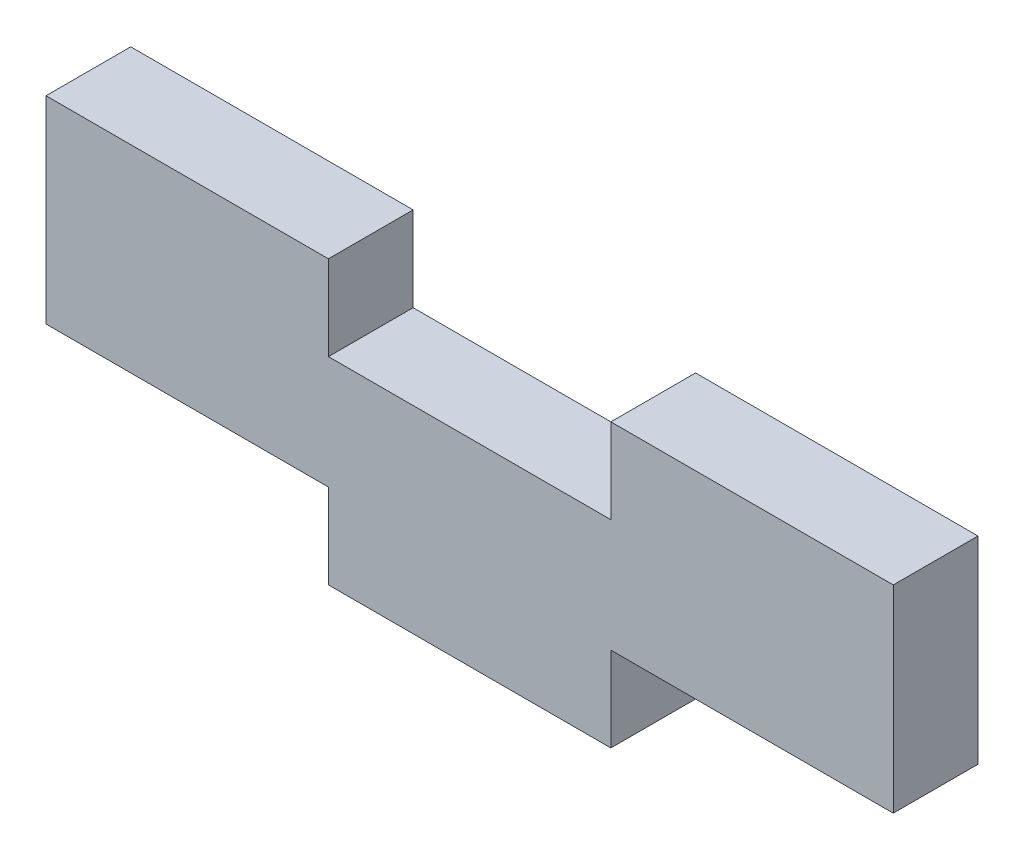
ISO-10303-21;
HEADER;
FILE_DESCRIPTION(('STEP AP214'),'2;1');
FILE_NAME('part.step','',(''),(''),'','','');
FILE_SCHEMA(('AUTOMOTIVE_DESIGN { 1 0 10303 214 1 1 1 1 }'));
ENDSEC;
DATA;
#1=APPLICATION_CONTEXT('core data for automotive mechanical design processes');
#2=APPLICATION_PROTOCOL_DEFINITION('international standard','automotive_design',2000,#1);
#3=PRODUCT_CONTEXT('',#1,'mechanical');
#4=PRODUCT('Part','Part','',(#3));
#5=PRODUCT_RELATED_PRODUCT_CATEGORY('part','',(#4));
#6=PRODUCT_DEFINITION_FORMATION('','',#4);
#7=PRODUCT_DEFINITION_CONTEXT('part definition',#1,'design');
#8=PRODUCT_DEFINITION('design','',#6,#7);
#9=PRODUCT_DEFINITION_SHAPE('','',#8);
#10=(LENGTH_UNIT() NAMED_UNIT(*) SI_UNIT(.MILLI.,.METRE.));
#11=(NAMED_UNIT(*) PLANE_ANGLE_UNIT() SI_UNIT($,.RADIAN.));
#12=(NAMED_UNIT(*) SI_UNIT($,.STERADIAN.) SOLID_ANGLE_UNIT());
#13=UNCERTAINTY_MEASURE_WITH_UNIT(LENGTH_MEASURE(1.E-05),#10,'distance_accuracy_value','');
#14=(GEOMETRIC_REPRESENTATION_CONTEXT(3) GLOBAL_UNCERTAINTY_ASSIGNED_CONTEXT((#13)) GLOBAL_UNIT_ASSIGNED_CONTEXT((#10,
#11,#12)) REPRESENTATION_CONTEXT('',''));
#15=CARTESIAN_POINT('',(0.,0.,0.));
#16=DIRECTION('',(0.,0.,1.));
#17=DIRECTION('',(1.,0.,0.));
#18=AXIS2_PLACEMENT_3D('',#15,#16,#17);
#19=CARTESIAN_POINT('',(0.,7.,3.));
#20=DIRECTION('',(-1.,0.,0.));
#21=DIRECTION('',(0.,-1.,0.));
#22=AXIS2_PLACEMENT_3D('',#19,#20,#21);
#23=PLANE('',#22);
#24=DIRECTION('',(0.,1.,0.));
#25=VECTOR('',#24,1.);
#26=CARTESIAN_POINT('',(0.,7.,0.));
#27=LINE('',#26,#25);
#28=CARTESIAN_POINT('',(0.,0.,0.));
#29=VERTEX_POINT('',#28);
#30=CARTESIAN_POINT('',(0.,7.,0.));
#31=VERTEX_POINT('',#30);
#32=EDGE_CURVE('E153',#29,#31,#27,.T.);
#33=ORIENTED_EDGE('',*,*,#32,.T.);
#34=DIRECTION('',(0.,0.,-1.));
#35=VECTOR('',#34,1.);
#36=CARTESIAN_POINT('',(0.,7.,3.));
#37=LINE('',#36,#35);
#38=CARTESIAN_POINT('',(0.,7.,3.));
#39=VERTEX_POINT('',#38);
#40=EDGE_CURVE('E11',#39,#31,#37,.T.);
#41=ORIENTED_EDGE('',*,*,#40,.F.);
#42=DIRECTION('',(0.,1.,0.));
#43=VECTOR('',#42,1.);
#44=CARTESIAN_POINT('',(0.,7.,3.));
#45=LINE('',#44,#43);
#46=CARTESIAN_POINT('',(0.,0.,3.));
#47=VERTEX_POINT('',#46);
#48=EDGE_CURVE('E175',#47,#39,#45,.T.);
#49=ORIENTED_EDGE('',*,*,#48,.F.);
#50=DIRECTION('',(0.,0.,-1.));
#51=VECTOR('',#50,1.);
#52=CARTESIAN_POINT('',(0.,0.,3.));
#53=LINE('',#52,#51);
#54=EDGE_CURVE('E149',#47,#29,#53,.T.);
#55=ORIENTED_EDGE('',*,*,#54,.T.);
#56=EDGE_LOOP('',(#33,#41,#49,#55));
#57=FACE_BOUND('',#56,.T.);
#58=ADVANCED_FACE('F33',(#57),#23,.F.);
#59=CARTESIAN_POINT('',(-10.,7.,3.));
#60=DIRECTION('',(0.,-1.,0.));
#61=DIRECTION('',(0.,0.,-1.));
#62=AXIS2_PLACEMENT_3D('',#59,#60,#61);
#63=PLANE('',#62);
#64=DIRECTION('',(-1.,0.,0.));
#65=VECTOR('',#64,1.);
#66=CARTESIAN_POINT('',(-10.,7.,0.));
#67=LINE('',#66,#65);
#68=CARTESIAN_POINT('',(-10.,7.,0.));
#69=VERTEX_POINT('',#68);
#70=EDGE_CURVE('E156',#31,#69,#67,.T.);
#71=ORIENTED_EDGE('',*,*,#70,.T.);
#72=DIRECTION('',(0.,0.,-1.));
#73=VECTOR('',#72,1.);
#74=CARTESIAN_POINT('',(-10.,7.,3.));
#75=LINE('',#74,#73);
#76=CARTESIAN_POINT('',(-10.,7.,3.));
#77=VERTEX_POINT('',#76);
#78=EDGE_CURVE('E41',#77,#69,#75,.T.);
#79=ORIENTED_EDGE('',*,*,#78,.F.);
#80=DIRECTION('',(-1.,0.,0.));
#81=VECTOR('',#80,1.);
#82=CARTESIAN_POINT('',(-10.,7.,3.));
#83=LINE('',#82,#81);
#84=EDGE_CURVE('E104',#39,#77,#83,.T.);
#85=ORIENTED_EDGE('',*,*,#84,.F.);
#86=ORIENTED_EDGE('',*,*,#40,.T.);
#87=EDGE_LOOP('',(#71,#79,#85,#86));
#88=FACE_BOUND('',#87,.T.);
#89=ADVANCED_FACE('F253',(#88),#63,.F.);
#90=CARTESIAN_POINT('',(-10.,4.,3.));
#91=DIRECTION('',(1.,0.,0.));
#92=DIRECTION('',(0.,0.,-1.));
#93=AXIS2_PLACEMENT_3D('',#90,#91,#92);
#94=PLANE('',#93);
#95=DIRECTION('',(0.,-1.,0.));
#96=VECTOR('',#95,1.);
#97=CARTESIAN_POINT('',(-10.,4.,0.));
#98=LINE('',#97,#96);
#99=CARTESIAN_POINT('',(-10.,4.,0.));
#100=VERTEX_POINT('',#99);
#101=EDGE_CURVE('E158',#69,#100,#98,.T.);
#102=ORIENTED_EDGE('',*,*,#101,.T.);
#103=DIRECTION('',(0.,0.,-1.));
#104=VECTOR('',#103,1.);
#105=CARTESIAN_POINT('',(-10.,4.,3.));
#106=LINE('',#105,#104);
#107=CARTESIAN_POINT('',(-10.,4.,3.));
#108=VERTEX_POINT('',#107);
#109=EDGE_CURVE('E194',#108,#100,#106,.T.);
#110=ORIENTED_EDGE('',*,*,#109,.F.);
#111=DIRECTION('',(0.,-1.,0.));
#112=VECTOR('',#111,1.);
#113=CARTESIAN_POINT('',(-10.,4.,3.));
#114=LINE('',#113,#112);
#115=EDGE_CURVE('E202',#77,#108,#114,.T.);
#116=ORIENTED_EDGE('',*,*,#115,.F.);
#117=ORIENTED_EDGE('',*,*,#78,.T.);
#118=EDGE_LOOP('',(#102,#110,#116,#117));
#119=FACE_BOUND('',#118,.T.);
#120=ADVANCED_FACE('F200',(#119),#94,.F.);
#121=CARTESIAN_POINT('',(-20.,4.,3.));
#122=DIRECTION('',(0.,-1.,0.));
#123=DIRECTION('',(0.,0.,-1.));
#124=AXIS2_PLACEMENT_3D('',#121,#122,#123);
#125=PLANE('',#124);
#126=DIRECTION('',(-1.,0.,0.));
#127=VECTOR('',#126,1.);
#128=CARTESIAN_POINT('',(-20.,4.,0.));
#129=LINE('',#128,#127);
#130=CARTESIAN_POINT('',(-20.,4.,0.));
#131=VERTEX_POINT('',#130);
#132=EDGE_CURVE('E160',#100,#131,#129,.T.);
#133=ORIENTED_EDGE('',*,*,#132,.T.);
#134=DIRECTION('',(0.,0.,-1.));
#135=VECTOR('',#134,1.);
#136=CARTESIAN_POINT('',(-20.,4.,3.));
#137=LINE('',#136,#135);
#138=CARTESIAN_POINT('',(-20.,4.,3.));
#139=VERTEX_POINT('',#138);
#140=EDGE_CURVE('E191',#139,#131,#137,.T.);
#141=ORIENTED_EDGE('',*,*,#140,.F.);
#142=DIRECTION('',(-1.,0.,0.));
#143=VECTOR('',#142,1.);
#144=CARTESIAN_POINT('',(-20.,4.,3.));
#145=LINE('',#144,#143);
#146=EDGE_CURVE('E220',#108,#139,#145,.T.);
#147=ORIENTED_EDGE('',*,*,#146,.F.);
#148=ORIENTED_EDGE('',*,*,#109,.T.);
#149=EDGE_LOOP('',(#133,#141,#147,#148));
#150=FACE_BOUND('',#149,.T.);
#151=ADVANCED_FACE('F211',(#150),#125,.F.);
#152=CARTESIAN_POINT('',(-20.,7.,3.));
#153=DIRECTION('',(-1.,0.,0.));
#154=DIRECTION('',(0.,0.,1.));
#155=AXIS2_PLACEMENT_3D('',#152,#153,#154);
#156=PLANE('',#155);
#157=DIRECTION('',(0.,1.,0.));
#158=VECTOR('',#157,1.);
#159=CARTESIAN_POINT('',(-20.,7.,0.));
#160=LINE('',#159,#158);
#161=CARTESIAN_POINT('',(-20.,7.,0.));
#162=VERTEX_POINT('',#161);
#163=EDGE_CURVE('E162',#131,#162,#160,.T.);
#164=ORIENTED_EDGE('',*,*,#163,.T.);
#165=DIRECTION('',(0.,0.,-1.));
#166=VECTOR('',#165,1.);
#167=CARTESIAN_POINT('',(-20.,7.,3.));
#168=LINE('',#167,#166);
#169=CARTESIAN_POINT('',(-20.,7.,3.));
#170=VERTEX_POINT('',#169);
#171=EDGE_CURVE('E188',#170,#162,#168,.T.);
#172=ORIENTED_EDGE('',*,*,#171,.F.);
#173=DIRECTION('',(0.,1.,0.));
#174=VECTOR('',#173,1.);
#175=CARTESIAN_POINT('',(-20.,7.,3.));
#176=LINE('',#175,#174);
#177=EDGE_CURVE('E217',#139,#170,#176,.T.);
#178=ORIENTED_EDGE('',*,*,#177,.F.);
#179=ORIENTED_EDGE('',*,*,#140,.T.);
#180=EDGE_LOOP('',(#164,#172,#178,#179));
#181=FACE_BOUND('',#180,.T.);
#182=ADVANCED_FACE('F215',(#181),#156,.F.);
#183=CARTESIAN_POINT('',(-30.,7.,3.));
#184=DIRECTION('',(0.,-1.,0.));
#185=DIRECTION('',(0.,0.,-1.));
#186=AXIS2_PLACEMENT_3D('',#183,#184,#185);
#187=PLANE('',#186);
#188=DIRECTION('',(-1.,0.,0.));
#189=VECTOR('',#188,1.);
#190=CARTESIAN_POINT('',(-30.,7.,0.));
#191=LINE('',#190,#189);
#192=CARTESIAN_POINT('',(-30.,7.,0.));
#193=VERTEX_POINT('',#192);
#194=EDGE_CURVE('E164',#162,#193,#191,.T.);
#195=ORIENTED_EDGE('',*,*,#194,.T.);
#196=DIRECTION('',(0.,0.,-1.));
#197=VECTOR('',#196,1.);
#198=CARTESIAN_POINT('',(-30.,7.,3.));
#199=LINE('',#198,#197);
#200=CARTESIAN_POINT('',(-30.,7.,3.));
#201=VERTEX_POINT('',#200);
#202=EDGE_CURVE('E185',#201,#193,#199,.T.);
#203=ORIENTED_EDGE('',*,*,#202,.F.);
#204=DIRECTION('',(-1.,0.,0.));
#205=VECTOR('',#204,1.);
#206=CARTESIAN_POINT('',(-30.,7.,3.));
#207=LINE('',#206,#205);
#208=EDGE_CURVE('E219',#170,#201,#207,.T.);
#209=ORIENTED_EDGE('',*,*,#208,.F.);
#210=ORIENTED_EDGE('',*,*,#171,.T.);
#211=EDGE_LOOP('',(#195,#203,#209,#210));
#212=FACE_BOUND('',#211,.T.);
#213=ADVANCED_FACE('F266',(#212),#187,.F.);
#214=CARTESIAN_POINT('',(-30.,0.,3.));
#215=DIRECTION('',(1.,0.,0.));
#216=DIRECTION('',(0.,0.,-1.));
#217=AXIS2_PLACEMENT_3D('',#214,#215,#216);
#218=PLANE('',#217);
#219=DIRECTION('',(0.,-1.,0.));
#220=VECTOR('',#219,1.);
#221=CARTESIAN_POINT('',(-30.,0.,0.));
#222=LINE('',#221,#220);
#223=CARTESIAN_POINT('',(-30.,0.,0.));
#224=VERTEX_POINT('',#223);
#225=EDGE_CURVE('E166',#193,#224,#222,.T.);
#226=ORIENTED_EDGE('',*,*,#225,.T.);
#227=DIRECTION('',(0.,0.,-1.));
#228=VECTOR('',#227,1.);
#229=CARTESIAN_POINT('',(-30.,0.,3.));
#230=LINE('',#229,#228);
#231=CARTESIAN_POINT('',(-30.,0.,3.));
#232=VERTEX_POINT('',#231);
#233=EDGE_CURVE('E182',#232,#224,#230,.T.);
#234=ORIENTED_EDGE('',*,*,#233,.F.);
#235=DIRECTION('',(0.,-1.,0.));
#236=VECTOR('',#235,1.);
#237=CARTESIAN_POINT('',(-30.,0.,3.));
#238=LINE('',#237,#236);
#239=EDGE_CURVE('E222',#201,#232,#238,.T.);
#240=ORIENTED_EDGE('',*,*,#239,.F.);
#241=ORIENTED_EDGE('',*,*,#202,.T.);
#242=EDGE_LOOP('',(#226,#234,#240,#241));
#243=FACE_BOUND('',#242,.T.);
#244=ADVANCED_FACE('F269',(#243),#218,.F.);
#245=CARTESIAN_POINT('',(-20.,0.,3.));
#246=DIRECTION('',(0.,1.,0.));
#247=DIRECTION('',(-1.,0.,0.));
#248=AXIS2_PLACEMENT_3D('',#245,#246,#247);
#249=PLANE('',#248);
#250=DIRECTION('',(1.,0.,0.));
#251=VECTOR('',#250,1.);
#252=CARTESIAN_POINT('',(-20.,0.,0.));
#253=LINE('',#252,#251);
#254=CARTESIAN_POINT('',(-20.,0.,0.));
#255=VERTEX_POINT('',#254);
#256=EDGE_CURVE('E168',#224,#255,#253,.T.);
#257=ORIENTED_EDGE('',*,*,#256,.T.);
#258=DIRECTION('',(0.,0.,-1.));
#259=VECTOR('',#258,1.);
#260=CARTESIAN_POINT('',(-20.,0.,3.));
#261=LINE('',#260,#259);
#262=CARTESIAN_POINT('',(-20.,0.,3.));
#263=VERTEX_POINT('',#262);
#264=EDGE_CURVE('E179',#263,#255,#261,.T.);
#265=ORIENTED_EDGE('',*,*,#264,.F.);
#266=DIRECTION('',(1.,0.,0.));
#267=VECTOR('',#266,1.);
#268=CARTESIAN_POINT('',(-20.,0.,3.));
#269=LINE('',#268,#267);
#270=EDGE_CURVE('E228',#232,#263,#269,.T.);
#271=ORIENTED_EDGE('',*,*,#270,.F.);
#272=ORIENTED_EDGE('',*,*,#233,.T.);
#273=EDGE_LOOP('',(#257,#265,#271,#272));
#274=FACE_BOUND('',#273,.T.);
#275=ADVANCED_FACE('F234',(#274),#249,.F.);
#276=CARTESIAN_POINT('',(-20.,-3.,3.));
#277=DIRECTION('',(1.,0.,0.));
#278=DIRECTION('',(0.,0.,-1.));
#279=AXIS2_PLACEMENT_3D('',#276,#277,#278);
#280=PLANE('',#279);
#281=DIRECTION('',(0.,-1.,0.));
#282=VECTOR('',#281,1.);
#283=CARTESIAN_POINT('',(-20.,-3.,0.));
#284=LINE('',#283,#282);
#285=CARTESIAN_POINT('',(-20.,-3.,0.));
#286=VERTEX_POINT('',#285);
#287=EDGE_CURVE('E170',#255,#286,#284,.T.);
#288=ORIENTED_EDGE('',*,*,#287,.T.);
#289=DIRECTION('',(0.,0.,-1.));
#290=VECTOR('',#289,1.);
#291=CARTESIAN_POINT('',(-20.,-3.,3.));
#292=LINE('',#291,#290);
#293=CARTESIAN_POINT('',(-20.,-3.,3.));
#294=VERTEX_POINT('',#293);
#295=EDGE_CURVE('E144',#294,#286,#292,.T.);
#296=ORIENTED_EDGE('',*,*,#295,.F.);
#297=DIRECTION('',(0.,-1.,0.));
#298=VECTOR('',#297,1.);
#299=CARTESIAN_POINT('',(-20.,-3.,3.));
#300=LINE('',#299,#298);
#301=EDGE_CURVE('E135',#263,#294,#300,.T.);
#302=ORIENTED_EDGE('',*,*,#301,.F.);
#303=ORIENTED_EDGE('',*,*,#264,.T.);
#304=EDGE_LOOP('',(#288,#296,#302,#303));
#305=FACE_BOUND('',#304,.T.);
#306=ADVANCED_FACE('F238',(#305),#280,.F.);
#307=CARTESIAN_POINT('',(-10.,-3.,3.));
#308=DIRECTION('',(0.,1.,0.));
#309=DIRECTION('',(-1.,0.,0.));
#310=AXIS2_PLACEMENT_3D('',#307,#308,#309);
#311=PLANE('',#310);
#312=DIRECTION('',(1.,0.,0.));
#313=VECTOR('',#312,1.);
#314=CARTESIAN_POINT('',(-10.,-3.,0.));
#315=LINE('',#314,#313);
#316=CARTESIAN_POINT('',(-10.,-3.,0.));
#317=VERTEX_POINT('',#316);
#318=EDGE_CURVE('E143',#286,#317,#315,.T.);
#319=ORIENTED_EDGE('',*,*,#318,.T.);
#320=DIRECTION('',(0.,0.,-1.));
#321=VECTOR('',#320,1.);
#322=CARTESIAN_POINT('',(-10.,-3.,3.));
#323=LINE('',#322,#321);
#324=CARTESIAN_POINT('',(-10.,-3.,3.));
#325=VERTEX_POINT('',#324);
#326=EDGE_CURVE('E140',#325,#317,#323,.T.);
#327=ORIENTED_EDGE('',*,*,#326,.F.);
#328=DIRECTION('',(1.,0.,0.));
#329=VECTOR('',#328,1.);
#330=CARTESIAN_POINT('',(-10.,-3.,3.));
#331=LINE('',#330,#329);
#332=EDGE_CURVE('E129',#294,#325,#331,.T.);
#333=ORIENTED_EDGE('',*,*,#332,.F.);
#334=ORIENTED_EDGE('',*,*,#295,.T.);
#335=EDGE_LOOP('',(#319,#327,#333,#334));
#336=FACE_BOUND('',#335,.T.);
#337=ADVANCED_FACE('F141',(#336),#311,.F.);
#338=CARTESIAN_POINT('',(-10.,0.,3.));
#339=DIRECTION('',(-1.,0.,0.));
#340=DIRECTION('',(0.,0.,1.));
#341=AXIS2_PLACEMENT_3D('',#338,#339,#340);
#342=PLANE('',#341);
#343=DIRECTION('',(0.,1.,0.));
#344=VECTOR('',#343,1.);
#345=CARTESIAN_POINT('',(-10.,0.,0.));
#346=LINE('',#345,#344);
#347=CARTESIAN_POINT('',(-10.,0.,0.));
#348=VERTEX_POINT('',#347);
#349=EDGE_CURVE('E90',#317,#348,#346,.T.);
#350=ORIENTED_EDGE('',*,*,#349,.T.);
#351=DIRECTION('',(0.,0.,-1.));
#352=VECTOR('',#351,1.);
#353=CARTESIAN_POINT('',(-10.,0.,3.));
#354=LINE('',#353,#352);
#355=CARTESIAN_POINT('',(-10.,0.,3.));
#356=VERTEX_POINT('',#355);
#357=EDGE_CURVE('E145',#356,#348,#354,.T.);
#358=ORIENTED_EDGE('',*,*,#357,.F.);
#359=DIRECTION('',(0.,1.,0.));
#360=VECTOR('',#359,1.);
#361=CARTESIAN_POINT('',(-10.,0.,3.));
#362=LINE('',#361,#360);
#363=EDGE_CURVE('E133',#325,#356,#362,.T.);
#364=ORIENTED_EDGE('',*,*,#363,.F.);
#365=ORIENTED_EDGE('',*,*,#326,.T.);
#366=EDGE_LOOP('',(#350,#358,#364,#365));
#367=FACE_BOUND('',#366,.T.);
#368=ADVANCED_FACE('F147',(#367),#342,.F.);
#369=CARTESIAN_POINT('',(0.,0.,3.));
#370=DIRECTION('',(0.,1.,0.));
#371=DIRECTION('',(0.,0.,1.));
#372=AXIS2_PLACEMENT_3D('',#369,#370,#371);
#373=PLANE('',#372);
#374=DIRECTION('',(1.,0.,0.));
#375=VECTOR('',#374,1.);
#376=CARTESIAN_POINT('',(0.,0.,0.));
#377=LINE('',#376,#375);
#378=EDGE_CURVE('E96',#348,#29,#377,.T.);
#379=ORIENTED_EDGE('',*,*,#378,.T.);
#380=ORIENTED_EDGE('',*,*,#54,.F.);
#381=DIRECTION('',(1.,0.,0.));
#382=VECTOR('',#381,1.);
#383=CARTESIAN_POINT('',(0.,0.,3.));
#384=LINE('',#383,#382);
#385=EDGE_CURVE('E49',#356,#47,#384,.T.);
#386=ORIENTED_EDGE('',*,*,#385,.F.);
#387=ORIENTED_EDGE('',*,*,#357,.T.);
#388=EDGE_LOOP('',(#379,#380,#386,#387));
#389=FACE_BOUND('',#388,.T.);
#390=ADVANCED_FACE('F242',(#389),#373,.F.);
#391=CARTESIAN_POINT('',(0.,0.,3.));
#392=DIRECTION('',(0.,0.,-1.));
#393=DIRECTION('',(-1.,0.,0.));
#394=AXIS2_PLACEMENT_3D('',#391,#392,#393);
#395=PLANE('',#394);
#396=ORIENTED_EDGE('',*,*,#48,.T.);
#397=ORIENTED_EDGE('',*,*,#84,.T.);
#398=ORIENTED_EDGE('',*,*,#115,.T.);
#399=ORIENTED_EDGE('',*,*,#146,.T.);
#400=ORIENTED_EDGE('',*,*,#177,.T.);
#401=ORIENTED_EDGE('',*,*,#208,.T.);
#402=ORIENTED_EDGE('',*,*,#239,.T.);
#403=ORIENTED_EDGE('',*,*,#270,.T.);
#404=ORIENTED_EDGE('',*,*,#301,.T.);
#405=ORIENTED_EDGE('',*,*,#332,.T.);
#406=ORIENTED_EDGE('',*,*,#363,.T.);
#407=ORIENTED_EDGE('',*,*,#385,.T.);
#408=EDGE_LOOP('',(#396,#397,#398,#399,#400,#401,#402,#403,#404,#405,#406,#407));
#409=FACE_BOUND('',#408,.T.);
#410=ADVANCED_FACE('F131',(#409),#395,.F.);
#411=CARTESIAN_POINT('',(0.,0.,0.));
#412=DIRECTION('',(0.,0.,-1.));
#413=DIRECTION('',(-1.,0.,0.));
#414=AXIS2_PLACEMENT_3D('',#411,#412,#413);
#415=PLANE('',#414);
#416=ORIENTED_EDGE('',*,*,#32,.F.);
#417=ORIENTED_EDGE('',*,*,#378,.F.);
#418=ORIENTED_EDGE('',*,*,#349,.F.);
#419=ORIENTED_EDGE('',*,*,#318,.F.);
#420=ORIENTED_EDGE('',*,*,#287,.F.);
#421=ORIENTED_EDGE('',*,*,#256,.F.);
#422=ORIENTED_EDGE('',*,*,#225,.F.);
#423=ORIENTED_EDGE('',*,*,#194,.F.);
#424=ORIENTED_EDGE('',*,*,#163,.F.);
#425=ORIENTED_EDGE('',*,*,#132,.F.);
#426=ORIENTED_EDGE('',*,*,#101,.F.);
#427=ORIENTED_EDGE('',*,*,#70,.F.);
#428=EDGE_LOOP('',(#416,#417,#418,#419,#420,#421,#422,#423,#424,#425,#426,#427));
#429=FACE_BOUND('',#428,.T.);
#430=ADVANCED_FACE('F206',(#429),#415,.T.);
#431=CLOSED_SHELL('',(#58,#89,#120,#151,#182,#213,#244,#275,#306,#337,#368,#390,#410,#430));
#432=MANIFOLD_SOLID_BREP('B2',#431);
#433=ADVANCED_BREP_SHAPE_REPRESENTATION('',(#18,#432),#14);
#434=SHAPE_DEFINITION_REPRESENTATION(#9,#433);
ENDSEC;
END-ISO-10303-21;
